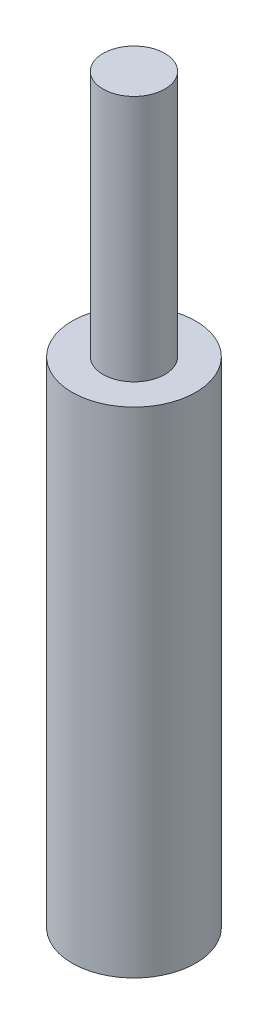
ISO-10303-21;
HEADER;
FILE_DESCRIPTION(('STEP AP214'),'2;1');
FILE_NAME('part.step','',(''),(''),'','','');
FILE_SCHEMA(('AUTOMOTIVE_DESIGN { 1 0 10303 214 1 1 1 1 }'));
ENDSEC;
DATA;
#1=APPLICATION_CONTEXT('core data for automotive mechanical design processes');
#2=APPLICATION_PROTOCOL_DEFINITION('international standard','automotive_design',2000,#1);
#3=PRODUCT_CONTEXT('',#1,'mechanical');
#4=PRODUCT('Part','Part','',(#3));
#5=PRODUCT_RELATED_PRODUCT_CATEGORY('part','',(#4));
#6=PRODUCT_DEFINITION_FORMATION('','',#4);
#7=PRODUCT_DEFINITION_CONTEXT('part definition',#1,'design');
#8=PRODUCT_DEFINITION('design','',#6,#7);
#9=PRODUCT_DEFINITION_SHAPE('','',#8);
#10=(LENGTH_UNIT() NAMED_UNIT(*) SI_UNIT(.MILLI.,.METRE.));
#11=(NAMED_UNIT(*) PLANE_ANGLE_UNIT() SI_UNIT($,.RADIAN.));
#12=(NAMED_UNIT(*) SI_UNIT($,.STERADIAN.) SOLID_ANGLE_UNIT());
#13=UNCERTAINTY_MEASURE_WITH_UNIT(LENGTH_MEASURE(1.E-05),#10,'distance_accuracy_value','');
#14=(GEOMETRIC_REPRESENTATION_CONTEXT(3) GLOBAL_UNCERTAINTY_ASSIGNED_CONTEXT((#13)) GLOBAL_UNIT_ASSIGNED_CONTEXT((#10,
#11,#12)) REPRESENTATION_CONTEXT('',''));
#15=CARTESIAN_POINT('',(0.,0.,0.));
#16=DIRECTION('',(0.,0.,1.));
#17=DIRECTION('',(1.,0.,0.));
#18=AXIS2_PLACEMENT_3D('',#15,#16,#17);
#19=CARTESIAN_POINT('',(0.,25.4,0.));
#20=DIRECTION('',(0.,-1.,0.));
#21=DIRECTION('',(0.,0.,-1.));
#22=AXIS2_PLACEMENT_3D('',#19,#20,#21);
#23=CYLINDRICAL_SURFACE('',#22,3.175);
#24=CARTESIAN_POINT('',(0.,25.4,0.));
#25=DIRECTION('',(0.,1.,0.));
#26=DIRECTION('',(0.,0.,1.));
#27=AXIS2_PLACEMENT_3D('',#24,#25,#26);
#28=CIRCLE('',#27,3.175);
#29=CARTESIAN_POINT('',(0.,25.4,3.175));
#30=VERTEX_POINT('',#29);
#31=EDGE_CURVE('E53',#30,#30,#28,.T.);
#32=ORIENTED_EDGE('',*,*,#31,.F.);
#33=EDGE_LOOP('',(#32));
#34=FACE_BOUND('',#33,.T.);
#35=CARTESIAN_POINT('',(0.,0.,0.));
#36=DIRECTION('',(0.,1.,0.));
#37=DIRECTION('',(0.,0.,1.));
#38=AXIS2_PLACEMENT_3D('',#35,#36,#37);
#39=CIRCLE('',#38,3.175);
#40=CARTESIAN_POINT('',(0.,0.,3.175));
#41=VERTEX_POINT('',#40);
#42=EDGE_CURVE('E48',#41,#41,#39,.T.);
#43=ORIENTED_EDGE('',*,*,#42,.T.);
#44=EDGE_LOOP('',(#43));
#45=FACE_BOUND('',#44,.T.);
#46=ADVANCED_FACE('F45',(#34,#45),#23,.T.);
#47=CARTESIAN_POINT('',(0.,25.4,0.));
#48=DIRECTION('',(0.,1.,0.));
#49=DIRECTION('',(0.,0.,1.));
#50=AXIS2_PLACEMENT_3D('',#47,#48,#49);
#51=PLANE('',#50);
#52=CARTESIAN_POINT('',(0.,25.4,0.));
#53=DIRECTION('',(0.,1.,0.));
#54=DIRECTION('',(0.,0.,1.));
#55=AXIS2_PLACEMENT_3D('',#52,#53,#54);
#56=CIRCLE('',#55,1.5875);
#57=CARTESIAN_POINT('',(0.,25.4,1.5875));
#58=VERTEX_POINT('',#57);
#59=EDGE_CURVE('E11',#58,#58,#56,.T.);
#60=ORIENTED_EDGE('',*,*,#59,.F.);
#61=EDGE_LOOP('',(#60));
#62=FACE_BOUND('',#61,.T.);
#63=ORIENTED_EDGE('',*,*,#31,.T.);
#64=EDGE_LOOP('',(#63));
#65=FACE_BOUND('',#64,.T.);
#66=ADVANCED_FACE('F89',(#62,#65),#51,.T.);
#67=CARTESIAN_POINT('',(0.,0.,0.));
#68=DIRECTION('',(0.,1.,0.));
#69=DIRECTION('',(0.,0.,1.));
#70=AXIS2_PLACEMENT_3D('',#67,#68,#69);
#71=PLANE('',#70);
#72=CARTESIAN_POINT('',(0.,0.,0.));
#73=DIRECTION('',(0.,-1.,0.));
#74=DIRECTION('',(0.,0.,-1.));
#75=AXIS2_PLACEMENT_3D('',#72,#73,#74);
#76=CIRCLE('',#75,1.58749999999999);
#77=CARTESIAN_POINT('',(0.,0.,-1.58749999999999));
#78=VERTEX_POINT('',#77);
#79=EDGE_CURVE('E69',#78,#78,#76,.T.);
#80=ORIENTED_EDGE('',*,*,#79,.F.);
#81=EDGE_LOOP('',(#80));
#82=FACE_BOUND('',#81,.T.);
#83=ORIENTED_EDGE('',*,*,#42,.F.);
#84=EDGE_LOOP('',(#83));
#85=FACE_BOUND('',#84,.T.);
#86=ADVANCED_FACE('F86',(#82,#85),#71,.F.);
#87=CARTESIAN_POINT('',(0.,38.1,0.));
#88=DIRECTION('',(0.,-1.,0.));
#89=DIRECTION('',(0.,0.,-1.));
#90=AXIS2_PLACEMENT_3D('',#87,#88,#89);
#91=CYLINDRICAL_SURFACE('',#90,1.5875);
#92=CARTESIAN_POINT('',(0.,38.1,0.));
#93=DIRECTION('',(0.,1.,0.));
#94=DIRECTION('',(0.,0.,1.));
#95=AXIS2_PLACEMENT_3D('',#92,#93,#94);
#96=CIRCLE('',#95,1.5875);
#97=CARTESIAN_POINT('',(0.,38.1,1.5875));
#98=VERTEX_POINT('',#97);
#99=EDGE_CURVE('E68',#98,#98,#96,.T.);
#100=ORIENTED_EDGE('',*,*,#99,.F.);
#101=EDGE_LOOP('',(#100));
#102=FACE_BOUND('',#101,.T.);
#103=ORIENTED_EDGE('',*,*,#59,.T.);
#104=EDGE_LOOP('',(#103));
#105=FACE_BOUND('',#104,.T.);
#106=ADVANCED_FACE('F88',(#102,#105),#91,.T.);
#107=CARTESIAN_POINT('',(0.,38.1,0.));
#108=DIRECTION('',(0.,1.,0.));
#109=DIRECTION('',(0.,0.,1.));
#110=AXIS2_PLACEMENT_3D('',#107,#108,#109);
#111=PLANE('',#110);
#112=ORIENTED_EDGE('',*,*,#99,.T.);
#113=EDGE_LOOP('',(#112));
#114=FACE_BOUND('',#113,.T.);
#115=ADVANCED_FACE('F61',(#114),#111,.T.);
#116=CARTESIAN_POINT('',(0.,12.7,0.));
#117=DIRECTION('',(0.,-1.,0.));
#118=DIRECTION('',(0.,0.,-1.));
#119=AXIS2_PLACEMENT_3D('',#116,#117,#118);
#120=CONICAL_SURFACE('',#119,1.58749999999999,1.02974425867665);
#121=CARTESIAN_POINT('',(0.,13.6538662327063,0.));
#122=VERTEX_POINT('',#121);
#123=VERTEX_LOOP('',#122);
#124=FACE_BOUND('',#123,.T.);
#125=CARTESIAN_POINT('',(0.,12.7,0.));
#126=DIRECTION('',(0.,-1.,0.));
#127=DIRECTION('',(0.,0.,-1.));
#128=AXIS2_PLACEMENT_3D('',#125,#126,#127);
#129=CIRCLE('',#128,1.58749999999999);
#130=CARTESIAN_POINT('',(0.,12.7,-1.58749999999999));
#131=VERTEX_POINT('',#130);
#132=EDGE_CURVE('E65',#131,#131,#129,.T.);
#133=ORIENTED_EDGE('',*,*,#132,.T.);
#134=EDGE_LOOP('',(#133));
#135=FACE_BOUND('',#134,.T.);
#136=ADVANCED_FACE('F57',(#124,#135),#120,.F.);
#137=CARTESIAN_POINT('',(0.,0.,0.));
#138=DIRECTION('',(0.,-1.,0.));
#139=DIRECTION('',(0.,0.,-1.));
#140=AXIS2_PLACEMENT_3D('',#137,#138,#139);
#141=CYLINDRICAL_SURFACE('',#140,1.58749999999999);
#142=ORIENTED_EDGE('',*,*,#132,.F.);
#143=EDGE_LOOP('',(#142));
#144=FACE_BOUND('',#143,.T.);
#145=ORIENTED_EDGE('',*,*,#79,.T.);
#146=EDGE_LOOP('',(#145));
#147=FACE_BOUND('',#146,.T.);
#148=ADVANCED_FACE('F60',(#144,#147),#141,.F.);
#149=CLOSED_SHELL('',(#46,#66,#86,#106,#115,#136,#148));
#150=MANIFOLD_SOLID_BREP('B2',#149);
#151=ADVANCED_BREP_SHAPE_REPRESENTATION('',(#18,#150),#14);
#152=SHAPE_DEFINITION_REPRESENTATION(#9,#151);
ENDSEC;
END-ISO-10303-21;
